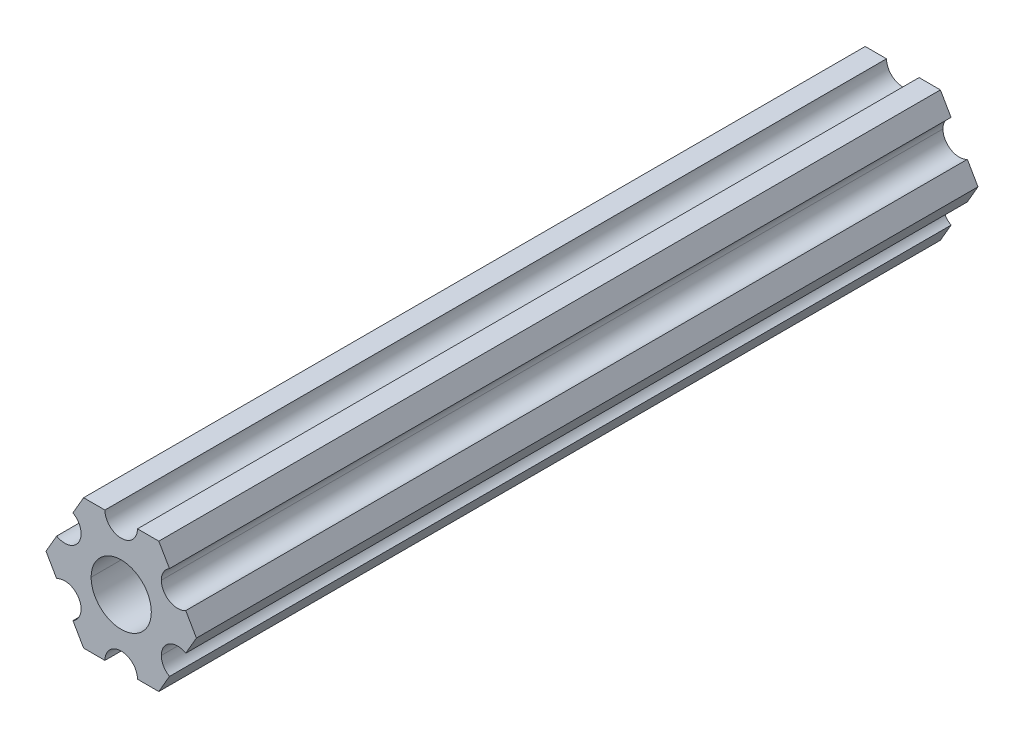
ISO-10303-21;
HEADER;
FILE_DESCRIPTION(('STEP AP214'),'2;1');
FILE_NAME('part.step','',(''),(''),'','','');
FILE_SCHEMA(('AUTOMOTIVE_DESIGN { 1 0 10303 214 1 1 1 1 }'));
ENDSEC;
DATA;
#1=APPLICATION_CONTEXT('core data for automotive mechanical design processes');
#2=APPLICATION_PROTOCOL_DEFINITION('international standard','automotive_design',2000,#1);
#3=PRODUCT_CONTEXT('',#1,'mechanical');
#4=PRODUCT('Part','Part','',(#3));
#5=PRODUCT_RELATED_PRODUCT_CATEGORY('part','',(#4));
#6=PRODUCT_DEFINITION_FORMATION('','',#4);
#7=PRODUCT_DEFINITION_CONTEXT('part definition',#1,'design');
#8=PRODUCT_DEFINITION('design','',#6,#7);
#9=PRODUCT_DEFINITION_SHAPE('','',#8);
#10=(LENGTH_UNIT() NAMED_UNIT(*) SI_UNIT(.MILLI.,.METRE.));
#11=(NAMED_UNIT(*) PLANE_ANGLE_UNIT() SI_UNIT($,.RADIAN.));
#12=(NAMED_UNIT(*) SI_UNIT($,.STERADIAN.) SOLID_ANGLE_UNIT());
#13=UNCERTAINTY_MEASURE_WITH_UNIT(LENGTH_MEASURE(1.E-05),#10,'distance_accuracy_value','');
#14=(GEOMETRIC_REPRESENTATION_CONTEXT(3) GLOBAL_UNCERTAINTY_ASSIGNED_CONTEXT((#13)) GLOBAL_UNIT_ASSIGNED_CONTEXT((#10,
#11,#12)) REPRESENTATION_CONTEXT('',''));
#15=CARTESIAN_POINT('',(0.,0.,0.));
#16=DIRECTION('',(0.,0.,1.));
#17=DIRECTION('',(1.,0.,0.));
#18=AXIS2_PLACEMENT_3D('',#15,#16,#17);
#19=CARTESIAN_POINT('',(6.29301142309098,-1.80018429024546,85.725));
#20=DIRECTION('',(-0.866025434075723,0.499999947533953,0.));
#21=DIRECTION('',(0.,0.,1.));
#22=AXIS2_PLACEMENT_3D('',#19,#20,#21);
#23=PLANE('',#22);
#24=DIRECTION('',(0.499999947533953,0.866025434075723,0.));
#25=VECTOR('',#24,1.);
#26=CARTESIAN_POINT('',(6.29301142309098,-1.80018429024546,76.2));
#27=LINE('',#26,#25);
#28=CARTESIAN_POINT('',(6.29301142309098,-1.80018429024546,76.2));
#29=VERTEX_POINT('',#28);
#30=CARTESIAN_POINT('',(7.33234841870826,4.44212519415746E-07,76.2));
#31=VERTEX_POINT('',#30);
#32=EDGE_CURVE('E398',#29,#31,#27,.T.);
#33=ORIENTED_EDGE('',*,*,#32,.F.);
#34=DIRECTION('',(0.,0.,-1.));
#35=VECTOR('',#34,1.);
#36=CARTESIAN_POINT('',(6.29301142309098,-1.80018429024546,85.725));
#37=LINE('',#36,#35);
#38=CARTESIAN_POINT('',(6.29301142309098,-1.80018429024546,0.));
#39=VERTEX_POINT('',#38);
#40=EDGE_CURVE('E270',#29,#39,#37,.T.);
#41=ORIENTED_EDGE('',*,*,#40,.T.);
#42=DIRECTION('',(0.499999947533953,0.866025434075723,0.));
#43=VECTOR('',#42,1.);
#44=CARTESIAN_POINT('',(6.29301142309098,-1.80018429024546,0.));
#45=LINE('',#44,#43);
#46=CARTESIAN_POINT('',(7.33234841870826,4.44212518961143E-07,0.));
#47=VERTEX_POINT('',#46);
#48=EDGE_CURVE('E292',#39,#47,#45,.T.);
#49=ORIENTED_EDGE('',*,*,#48,.T.);
#50=DIRECTION('',(0.,0.,1.));
#51=VECTOR('',#50,1.);
#52=CARTESIAN_POINT('',(7.33234841870827,4.44212519169686E-07,85.725));
#53=LINE('',#52,#51);
#54=EDGE_CURVE('E65',#47,#31,#53,.T.);
#55=ORIENTED_EDGE('',*,*,#54,.T.);
#56=EDGE_LOOP('',(#33,#41,#49,#55));
#57=FACE_BOUND('',#56,.T.);
#58=ADVANCED_FACE('F57',(#57),#23,.F.);
#59=CARTESIAN_POINT('',(7.33234841870827,4.44212519169686E-07,85.725));
#60=DIRECTION('',(-0.866025373493145,-0.500000052466057,0.));
#61=DIRECTION('',(-0.500000052466057,0.866025373493145,0.));
#62=AXIS2_PLACEMENT_3D('',#59,#60,#61);
#63=PLANE('',#62);
#64=DIRECTION('',(-0.500000052466057,0.866025373493145,0.));
#65=VECTOR('',#64,1.);
#66=CARTESIAN_POINT('',(7.33234841870827,4.44212519169686E-07,76.2));
#67=LINE('',#66,#65);
#68=CARTESIAN_POINT('',(6.29301120497139,1.80018505273895,76.2));
#69=VERTEX_POINT('',#68);
#70=EDGE_CURVE('E406',#31,#69,#67,.T.);
#71=ORIENTED_EDGE('',*,*,#70,.F.);
#72=ORIENTED_EDGE('',*,*,#54,.F.);
#73=DIRECTION('',(-0.500000052466057,0.866025373493145,0.));
#74=VECTOR('',#73,1.);
#75=CARTESIAN_POINT('',(7.33234841870827,4.44212519198906E-07,0.));
#76=LINE('',#75,#74);
#77=CARTESIAN_POINT('',(6.29301120497139,1.80018505273894,0.));
#78=VERTEX_POINT('',#77);
#79=EDGE_CURVE('E288',#47,#78,#76,.T.);
#80=ORIENTED_EDGE('',*,*,#79,.T.);
#81=DIRECTION('',(0.,0.,1.));
#82=VECTOR('',#81,1.);
#83=CARTESIAN_POINT('',(6.29301120497139,1.80018505273894,85.725));
#84=LINE('',#83,#82);
#85=EDGE_CURVE('E390',#78,#69,#84,.T.);
#86=ORIENTED_EDGE('',*,*,#85,.T.);
#87=EDGE_LOOP('',(#71,#72,#80,#86));
#88=FACE_BOUND('',#87,.T.);
#89=ADVANCED_FACE('F404',(#88),#63,.F.);
#90=CARTESIAN_POINT('',(5.49926112168156,3.17500033315934,85.725));
#91=DIRECTION('',(0.,0.,-1.));
#92=DIRECTION('',(-1.,0.,0.));
#93=AXIS2_PLACEMENT_3D('',#90,#91,#92);
#94=CYLINDRICAL_SURFACE('',#93,1.5875);
#95=CARTESIAN_POINT('',(5.49926112168156,3.17500033315934,76.2));
#96=DIRECTION('',(0.,0.,1.));
#97=DIRECTION('',(1.,0.,0.));
#98=AXIS2_PLACEMENT_3D('',#95,#96,#97);
#99=CIRCLE('',#98,1.5875);
#100=CARTESIAN_POINT('',(3.91176112168156,3.17500033315934,76.2));
#101=VERTEX_POINT('',#100);
#102=EDGE_CURVE('E409',#69,#101,#99,.F.);
#103=ORIENTED_EDGE('',*,*,#102,.F.);
#104=ORIENTED_EDGE('',*,*,#85,.F.);
#105=CARTESIAN_POINT('',(5.49926112168156,3.17500033315934,0.));
#106=DIRECTION('',(0.,0.,-1.));
#107=DIRECTION('',(-1.,0.,0.));
#108=AXIS2_PLACEMENT_3D('',#105,#106,#107);
#109=CIRCLE('',#108,1.5875);
#110=CARTESIAN_POINT('',(3.91176112168156,3.17500033315934,0.));
#111=VERTEX_POINT('',#110);
#112=EDGE_CURVE('E262',#78,#111,#109,.T.);
#113=ORIENTED_EDGE('',*,*,#112,.T.);
#114=DIRECTION('',(0.,0.,-1.));
#115=VECTOR('',#114,1.);
#116=CARTESIAN_POINT('',(3.91176112168156,3.17500033315934,85.725));
#117=LINE('',#116,#115);
#118=EDGE_CURVE('E273',#101,#111,#117,.T.);
#119=ORIENTED_EDGE('',*,*,#118,.F.);
#120=EDGE_LOOP('',(#103,#104,#113,#119));
#121=FACE_BOUND('',#120,.T.);
#122=ADVANCED_FACE('F869',(#121),#94,.F.);
#123=CARTESIAN_POINT('',(4.70551103839172,4.54981561357972,85.725));
#124=DIRECTION('',(-0.866025373493151,-0.500000052466046,0.));
#125=DIRECTION('',(-0.500000052466046,0.866025373493151,0.));
#126=AXIS2_PLACEMENT_3D('',#123,#124,#125);
#127=PLANE('',#126);
#128=DIRECTION('',(-0.500000052466046,0.866025373493151,0.));
#129=VECTOR('',#128,1.);
#130=CARTESIAN_POINT('',(4.70551103839172,4.54981561357972,76.2));
#131=LINE('',#130,#129);
#132=CARTESIAN_POINT('',(4.70551103839172,4.54981561357972,76.2));
#133=VERTEX_POINT('',#132);
#134=CARTESIAN_POINT('',(3.66617382465481,6.35000022210627,76.2));
#135=VERTEX_POINT('',#134);
#136=EDGE_CURVE('E479',#133,#135,#131,.T.);
#137=ORIENTED_EDGE('',*,*,#136,.F.);
#138=DIRECTION('',(0.,0.,1.));
#139=VECTOR('',#138,1.);
#140=CARTESIAN_POINT('',(4.70551103839172,4.54981561357972,85.725));
#141=LINE('',#140,#139);
#142=CARTESIAN_POINT('',(4.70551103839172,4.54981561357972,0.));
#143=VERTEX_POINT('',#142);
#144=EDGE_CURVE('E281',#143,#133,#141,.T.);
#145=ORIENTED_EDGE('',*,*,#144,.F.);
#146=DIRECTION('',(-0.500000052466046,0.866025373493151,0.));
#147=VECTOR('',#146,1.);
#148=CARTESIAN_POINT('',(4.70551103839172,4.54981561357972,0.));
#149=LINE('',#148,#147);
#150=CARTESIAN_POINT('',(3.66617382465481,6.35000022210627,0.));
#151=VERTEX_POINT('',#150);
#152=EDGE_CURVE('E259',#143,#151,#149,.T.);
#153=ORIENTED_EDGE('',*,*,#152,.T.);
#154=DIRECTION('',(0.,0.,1.));
#155=VECTOR('',#154,1.);
#156=CARTESIAN_POINT('',(3.66617382465481,6.35000022210627,85.725));
#157=LINE('',#156,#155);
#158=EDGE_CURVE('E386',#151,#135,#157,.T.);
#159=ORIENTED_EDGE('',*,*,#158,.T.);
#160=EDGE_LOOP('',(#137,#145,#153,#159));
#161=FACE_BOUND('',#160,.T.);
#162=ADVANCED_FACE('F491',(#161),#127,.F.);
#163=CARTESIAN_POINT('',(3.66617382465481,6.35000022210627,85.725));
#164=DIRECTION('',(6.05825850611185E-08,-1.,0.));
#165=DIRECTION('',(0.,0.,-1.));
#166=AXIS2_PLACEMENT_3D('',#163,#164,#165);
#167=PLANE('',#166);
#168=DIRECTION('',(-0.999999999999998,-6.05825850611184E-08,0.));
#169=VECTOR('',#168,1.);
#170=CARTESIAN_POINT('',(3.66617382465481,6.35000022210627,76.2));
#171=LINE('',#170,#169);
#172=CARTESIAN_POINT('',(1.58749961530074,6.35,76.2));
#173=VERTEX_POINT('',#172);
#174=EDGE_CURVE('E476',#135,#173,#171,.T.);
#175=ORIENTED_EDGE('',*,*,#174,.F.);
#176=ORIENTED_EDGE('',*,*,#158,.F.);
#177=DIRECTION('',(-1.,0.,0.));
#178=VECTOR('',#177,1.);
#179=CARTESIAN_POINT('',(5.49926112168156,6.35000022210627,0.));
#180=LINE('',#179,#178);
#181=CARTESIAN_POINT('',(1.58749961530073,6.35000015914054,0.));
#182=VERTEX_POINT('',#181);
#183=EDGE_CURVE('E263',#151,#182,#180,.T.);
#184=ORIENTED_EDGE('',*,*,#183,.T.);
#185=DIRECTION('',(0.,0.,1.));
#186=VECTOR('',#185,1.);
#187=CARTESIAN_POINT('',(1.58749961530074,6.35000009617482,85.725));
#188=LINE('',#187,#186);
#189=EDGE_CURVE('E303',#182,#173,#188,.T.);
#190=ORIENTED_EDGE('',*,*,#189,.T.);
#191=EDGE_LOOP('',(#175,#176,#184,#190));
#192=FACE_BOUND('',#191,.T.);
#193=ADVANCED_FACE('F498',(#192),#167,.F.);
#194=CARTESIAN_POINT('',(-3.84699260060323E-07,6.35,85.725));
#195=DIRECTION('',(0.,0.,-1.));
#196=DIRECTION('',(-1.,0.,0.));
#197=AXIS2_PLACEMENT_3D('',#194,#195,#196);
#198=CYLINDRICAL_SURFACE('',#197,1.5875);
#199=CARTESIAN_POINT('',(-3.84699260060323E-07,6.35,76.2));
#200=DIRECTION('',(0.,0.,1.));
#201=DIRECTION('',(1.,0.,0.));
#202=AXIS2_PLACEMENT_3D('',#199,#200,#201);
#203=CIRCLE('',#202,1.5875);
#204=CARTESIAN_POINT('',(-1.58750038469926,6.34999990382518,76.2));
#205=VERTEX_POINT('',#204);
#206=EDGE_CURVE('E473',#173,#205,#203,.F.);
#207=ORIENTED_EDGE('',*,*,#206,.F.);
#208=ORIENTED_EDGE('',*,*,#189,.F.);
#209=CARTESIAN_POINT('',(-3.84699260060323E-07,6.35,0.));
#210=DIRECTION('',(0.,0.,-1.));
#211=DIRECTION('',(-1.,0.,0.));
#212=AXIS2_PLACEMENT_3D('',#209,#210,#211);
#213=CIRCLE('',#212,1.5875);
#214=CARTESIAN_POINT('',(-1.58750038469926,6.34999990382519,0.));
#215=VERTEX_POINT('',#214);
#216=EDGE_CURVE('E329',#182,#215,#213,.T.);
#217=ORIENTED_EDGE('',*,*,#216,.T.);
#218=DIRECTION('',(0.,0.,1.));
#219=VECTOR('',#218,1.);
#220=CARTESIAN_POINT('',(-1.58750038469926,6.34999990382518,85.725));
#221=LINE('',#220,#219);
#222=EDGE_CURVE('E299',#215,#205,#221,.T.);
#223=ORIENTED_EDGE('',*,*,#222,.T.);
#224=EDGE_LOOP('',(#207,#208,#217,#223));
#225=FACE_BOUND('',#224,.T.);
#226=ADVANCED_FACE('F502',(#225),#198,.F.);
#227=CARTESIAN_POINT('',(-1.58750038469926,6.34999990382518,85.725));
#228=DIRECTION('',(6.05825963273174E-08,-1.,0.));
#229=DIRECTION('',(0.,0.,-1.));
#230=AXIS2_PLACEMENT_3D('',#227,#228,#229);
#231=PLANE('',#230);
#232=DIRECTION('',(-0.999999999999998,-6.05825963273173E-08,0.));
#233=VECTOR('',#232,1.);
#234=CARTESIAN_POINT('',(-1.58750038469926,6.34999990382518,76.2));
#235=LINE('',#234,#233);
#236=CARTESIAN_POINT('',(-3.66617454558244,6.34999986184803,76.2));
#237=VERTEX_POINT('',#236);
#238=EDGE_CURVE('E470',#205,#237,#235,.T.);
#239=ORIENTED_EDGE('',*,*,#238,.F.);
#240=ORIENTED_EDGE('',*,*,#222,.F.);
#241=DIRECTION('',(-1.,0.,0.));
#242=VECTOR('',#241,1.);
#243=CARTESIAN_POINT('',(5.49926112168156,6.34999990382519,0.));
#244=LINE('',#243,#242);
#245=CARTESIAN_POINT('',(-3.66617454558244,6.34999986184803,0.));
#246=VERTEX_POINT('',#245);
#247=EDGE_CURVE('E333',#215,#246,#244,.T.);
#248=ORIENTED_EDGE('',*,*,#247,.T.);
#249=DIRECTION('',(0.,0.,1.));
#250=VECTOR('',#249,1.);
#251=CARTESIAN_POINT('',(-3.66617459405349,6.3499997778937,85.725));
#252=LINE('',#251,#250);
#253=EDGE_CURVE('E286',#246,#237,#252,.T.);
#254=ORIENTED_EDGE('',*,*,#253,.T.);
#255=EDGE_LOOP('',(#239,#240,#248,#254));
#256=FACE_BOUND('',#255,.T.);
#257=ADVANCED_FACE('F504',(#256),#231,.F.);
#258=CARTESIAN_POINT('',(-3.66617459405349,6.3499997778937,85.725));
#259=DIRECTION('',(0.866025434075729,-0.499999947533942,0.));
#260=DIRECTION('',(0.,0.,-1.));
#261=AXIS2_PLACEMENT_3D('',#258,#259,#260);
#262=PLANE('',#261);
#263=DIRECTION('',(-0.499999947533942,-0.866025434075729,0.));
#264=VECTOR('',#263,1.);
#265=CARTESIAN_POINT('',(-3.66617459405349,6.3499997778937,76.2));
#266=LINE('',#265,#264);
#267=CARTESIAN_POINT('',(-4.70551158967065,4.54981504343587,76.2));
#268=VERTEX_POINT('',#267);
#269=EDGE_CURVE('E467',#237,#268,#266,.T.);
#270=ORIENTED_EDGE('',*,*,#269,.F.);
#271=ORIENTED_EDGE('',*,*,#253,.F.);
#272=DIRECTION('',(-0.499999947533943,-0.866025434075729,0.));
#273=VECTOR('',#272,1.);
#274=CARTESIAN_POINT('',(-3.66617459405349,6.3499997778937,0.));
#275=LINE('',#274,#273);
#276=CARTESIAN_POINT('',(-4.70551158967065,4.54981504343587,0.));
#277=VERTEX_POINT('',#276);
#278=EDGE_CURVE('E345',#246,#277,#275,.T.);
#279=ORIENTED_EDGE('',*,*,#278,.T.);
#280=DIRECTION('',(0.,0.,1.));
#281=VECTOR('',#280,1.);
#282=CARTESIAN_POINT('',(-4.70551158967065,4.54981504343587,85.725));
#283=LINE('',#282,#281);
#284=EDGE_CURVE('E282',#277,#268,#283,.T.);
#285=ORIENTED_EDGE('',*,*,#284,.T.);
#286=EDGE_LOOP('',(#270,#271,#279,#285));
#287=FACE_BOUND('',#286,.T.);
#288=ADVANCED_FACE('F509',(#287),#262,.F.);
#289=CARTESIAN_POINT('',(-5.49926150638082,3.17499966684067,85.725));
#290=DIRECTION('',(0.,0.,-1.));
#291=DIRECTION('',(-1.,0.,0.));
#292=AXIS2_PLACEMENT_3D('',#289,#290,#291);
#293=CYLINDRICAL_SURFACE('',#292,1.5875);
#294=CARTESIAN_POINT('',(-5.49926150638082,3.17499966684067,76.2));
#295=DIRECTION('',(0.,0.,1.));
#296=DIRECTION('',(1.,0.,0.));
#297=AXIS2_PLACEMENT_3D('',#294,#295,#296);
#298=CIRCLE('',#297,1.5875);
#299=CARTESIAN_POINT('',(-6.29301142309098,1.80018429024547,76.2));
#300=VERTEX_POINT('',#299);
#301=EDGE_CURVE('E464',#268,#300,#298,.F.);
#302=ORIENTED_EDGE('',*,*,#301,.F.);
#303=ORIENTED_EDGE('',*,*,#284,.F.);
#304=CARTESIAN_POINT('',(-5.49926150638082,3.17499966684067,0.));
#305=DIRECTION('',(0.,0.,-1.));
#306=DIRECTION('',(-1.,0.,0.));
#307=AXIS2_PLACEMENT_3D('',#304,#305,#306);
#308=CIRCLE('',#307,1.5875);
#309=CARTESIAN_POINT('',(-6.29301142309098,1.80018429024547,0.));
#310=VERTEX_POINT('',#309);
#311=EDGE_CURVE('E341',#277,#310,#308,.T.);
#312=ORIENTED_EDGE('',*,*,#311,.T.);
#313=DIRECTION('',(0.,0.,1.));
#314=VECTOR('',#313,1.);
#315=CARTESIAN_POINT('',(-6.29301142309098,1.80018429024547,85.725));
#316=LINE('',#315,#314);
#317=EDGE_CURVE('E287',#310,#300,#316,.T.);
#318=ORIENTED_EDGE('',*,*,#317,.T.);
#319=EDGE_LOOP('',(#302,#303,#312,#318));
#320=FACE_BOUND('',#319,.T.);
#321=ADVANCED_FACE('F512',(#320),#293,.F.);
#322=CARTESIAN_POINT('',(-6.29301142309098,1.80018429024547,85.725));
#323=DIRECTION('',(0.866025434075724,-0.499999947533952,0.));
#324=DIRECTION('',(0.,0.,-1.));
#325=AXIS2_PLACEMENT_3D('',#322,#323,#324);
#326=PLANE('',#325);
#327=DIRECTION('',(-0.499999947533952,-0.866025434075724,0.));
#328=VECTOR('',#327,1.);
#329=CARTESIAN_POINT('',(-6.29301142309098,1.80018429024547,76.2));
#330=LINE('',#329,#328);
#331=CARTESIAN_POINT('',(-7.33234841870827,-4.44212524036369E-07,76.2));
#332=VERTEX_POINT('',#331);
#333=EDGE_CURVE('E461',#300,#332,#330,.T.);
#334=ORIENTED_EDGE('',*,*,#333,.F.);
#335=ORIENTED_EDGE('',*,*,#317,.F.);
#336=DIRECTION('',(-0.499999947533952,-0.866025434075724,0.));
#337=VECTOR('',#336,1.);
#338=CARTESIAN_POINT('',(-6.29301142309098,1.80018429024547,0.));
#339=LINE('',#338,#337);
#340=CARTESIAN_POINT('',(-7.33234841870826,-4.44212524036367E-07,0.));
#341=VERTEX_POINT('',#340);
#342=EDGE_CURVE('E337',#310,#341,#339,.T.);
#343=ORIENTED_EDGE('',*,*,#342,.T.);
#344=DIRECTION('',(0.,0.,1.));
#345=VECTOR('',#344,1.);
#346=CARTESIAN_POINT('',(-7.33234841870827,-4.44212523790841E-07,85.725));
#347=LINE('',#346,#345);
#348=EDGE_CURVE('E269',#341,#332,#347,.T.);
#349=ORIENTED_EDGE('',*,*,#348,.T.);
#350=EDGE_LOOP('',(#334,#335,#343,#349));
#351=FACE_BOUND('',#350,.T.);
#352=ADVANCED_FACE('F517',(#351),#326,.F.);
#353=CARTESIAN_POINT('',(-7.33234841870827,-4.44212523790841E-07,85.725));
#354=DIRECTION('',(0.866025373493151,0.500000052466045,0.));
#355=DIRECTION('',(0.,0.,-1.));
#356=AXIS2_PLACEMENT_3D('',#353,#354,#355);
#357=PLANE('',#356);
#358=DIRECTION('',(0.500000052466045,-0.866025373493151,0.));
#359=VECTOR('',#358,1.);
#360=CARTESIAN_POINT('',(-7.33234841870827,-4.44212523790841E-07,76.2));
#361=LINE('',#360,#359);
#362=CARTESIAN_POINT('',(-6.29301120497141,-1.80018505273896,76.2));
#363=VERTEX_POINT('',#362);
#364=EDGE_CURVE('E458',#332,#363,#361,.T.);
#365=ORIENTED_EDGE('',*,*,#364,.F.);
#366=ORIENTED_EDGE('',*,*,#348,.F.);
#367=DIRECTION('',(0.500000052466045,-0.866025373493151,0.));
#368=VECTOR('',#367,1.);
#369=CARTESIAN_POINT('',(-7.33234841870827,-4.44212523969395E-07,0.));
#370=LINE('',#369,#368);
#371=CARTESIAN_POINT('',(-6.29301120497141,-1.80018505273897,0.));
#372=VERTEX_POINT('',#371);
#373=EDGE_CURVE('E308',#341,#372,#370,.T.);
#374=ORIENTED_EDGE('',*,*,#373,.T.);
#375=DIRECTION('',(0.,0.,1.));
#376=VECTOR('',#375,1.);
#377=CARTESIAN_POINT('',(-6.29301120497141,-1.80018505273897,85.725));
#378=LINE('',#377,#376);
#379=EDGE_CURVE('E265',#372,#363,#378,.T.);
#380=ORIENTED_EDGE('',*,*,#379,.T.);
#381=EDGE_LOOP('',(#365,#366,#374,#380));
#382=FACE_BOUND('',#381,.T.);
#383=ADVANCED_FACE('F520',(#382),#357,.F.);
#384=CARTESIAN_POINT('',(-5.49926112168156,-3.17500033315934,85.725));
#385=DIRECTION('',(0.,0.,-1.));
#386=DIRECTION('',(-1.,0.,0.));
#387=AXIS2_PLACEMENT_3D('',#384,#385,#386);
#388=CYLINDRICAL_SURFACE('',#387,1.5875);
#389=CARTESIAN_POINT('',(-5.49926112168156,-3.17500033315934,76.2));
#390=DIRECTION('',(0.,0.,1.));
#391=DIRECTION('',(1.,0.,0.));
#392=AXIS2_PLACEMENT_3D('',#389,#390,#391);
#393=CIRCLE('',#392,1.5875);
#394=CARTESIAN_POINT('',(-4.70551103839172,-4.54981561357972,76.2));
#395=VERTEX_POINT('',#394);
#396=EDGE_CURVE('E455',#363,#395,#393,.F.);
#397=ORIENTED_EDGE('',*,*,#396,.F.);
#398=ORIENTED_EDGE('',*,*,#379,.F.);
#399=CARTESIAN_POINT('',(-5.49926112168156,-3.17500033315934,0.));
#400=DIRECTION('',(0.,0.,-1.));
#401=DIRECTION('',(-1.,0.,0.));
#402=AXIS2_PLACEMENT_3D('',#399,#400,#401);
#403=CIRCLE('',#402,1.5875);
#404=CARTESIAN_POINT('',(-4.70551103839172,-4.54981561357972,0.));
#405=VERTEX_POINT('',#404);
#406=EDGE_CURVE('E304',#372,#405,#403,.T.);
#407=ORIENTED_EDGE('',*,*,#406,.T.);
#408=DIRECTION('',(0.,0.,1.));
#409=VECTOR('',#408,1.);
#410=CARTESIAN_POINT('',(-4.70551103839172,-4.54981561357972,85.725));
#411=LINE('',#410,#409);
#412=EDGE_CURVE('E252',#405,#395,#411,.T.);
#413=ORIENTED_EDGE('',*,*,#412,.T.);
#414=EDGE_LOOP('',(#397,#398,#407,#413));
#415=FACE_BOUND('',#414,.T.);
#416=ADVANCED_FACE('F526',(#415),#388,.F.);
#417=CARTESIAN_POINT('',(-4.70551103839172,-4.54981561357972,85.725));
#418=DIRECTION('',(0.866025373493152,0.500000052466045,0.));
#419=DIRECTION('',(0.,0.,-1.));
#420=AXIS2_PLACEMENT_3D('',#417,#418,#419);
#421=PLANE('',#420);
#422=DIRECTION('',(0.500000052466045,-0.866025373493152,0.));
#423=VECTOR('',#422,1.);
#424=CARTESIAN_POINT('',(-4.70551103839172,-4.54981561357972,76.2));
#425=LINE('',#424,#423);
#426=CARTESIAN_POINT('',(-3.66617382465481,-6.35000022210628,76.2));
#427=VERTEX_POINT('',#426);
#428=EDGE_CURVE('E452',#395,#427,#425,.T.);
#429=ORIENTED_EDGE('',*,*,#428,.F.);
#430=ORIENTED_EDGE('',*,*,#412,.F.);
#431=DIRECTION('',(0.500000052466045,-0.866025373493151,0.));
#432=VECTOR('',#431,1.);
#433=CARTESIAN_POINT('',(-4.70551103839172,-4.54981561357972,0.));
#434=LINE('',#433,#432);
#435=CARTESIAN_POINT('',(-3.66617382465481,-6.35000022210628,0.));
#436=VERTEX_POINT('',#435);
#437=EDGE_CURVE('E309',#405,#436,#434,.T.);
#438=ORIENTED_EDGE('',*,*,#437,.T.);
#439=DIRECTION('',(0.,0.,1.));
#440=VECTOR('',#439,1.);
#441=CARTESIAN_POINT('',(-3.66617382465481,-6.35000022210628,85.725));
#442=LINE('',#441,#440);
#443=EDGE_CURVE('E370',#436,#427,#442,.T.);
#444=ORIENTED_EDGE('',*,*,#443,.T.);
#445=EDGE_LOOP('',(#429,#430,#438,#444));
#446=FACE_BOUND('',#445,.T.);
#447=ADVANCED_FACE('F807',(#446),#421,.F.);
#448=CARTESIAN_POINT('',(-3.66617382465481,-6.35000022210628,85.725));
#449=DIRECTION('',(-6.05825854783851E-08,1.,0.));
#450=DIRECTION('',(0.,0.,1.));
#451=AXIS2_PLACEMENT_3D('',#448,#449,#450);
#452=PLANE('',#451);
#453=DIRECTION('',(0.999999999999998,6.0582585478385E-08,0.));
#454=VECTOR('',#453,1.);
#455=CARTESIAN_POINT('',(-3.66617382465481,-6.35000022210628,76.2));
#456=LINE('',#455,#454);
#457=CARTESIAN_POINT('',(-1.58749961530073,-6.35000011105314,76.2));
#458=VERTEX_POINT('',#457);
#459=EDGE_CURVE('E449',#427,#458,#456,.T.);
#460=ORIENTED_EDGE('',*,*,#459,.F.);
#461=ORIENTED_EDGE('',*,*,#443,.F.);
#462=DIRECTION('',(1.,0.,0.));
#463=VECTOR('',#462,1.);
#464=CARTESIAN_POINT('',(5.49926112168156,-6.35000022210628,0.));
#465=LINE('',#464,#463);
#466=CARTESIAN_POINT('',(-1.58749961530073,-6.35000011105314,0.));
#467=VERTEX_POINT('',#466);
#468=EDGE_CURVE('E322',#436,#467,#465,.T.);
#469=ORIENTED_EDGE('',*,*,#468,.T.);
#470=DIRECTION('',(0.,0.,1.));
#471=VECTOR('',#470,1.);
#472=CARTESIAN_POINT('',(-1.58749961530074,-6.35,85.725));
#473=LINE('',#472,#471);
#474=EDGE_CURVE('E369',#467,#458,#473,.T.);
#475=ORIENTED_EDGE('',*,*,#474,.T.);
#476=EDGE_LOOP('',(#460,#461,#469,#475));
#477=FACE_BOUND('',#476,.T.);
#478=ADVANCED_FACE('F799',(#477),#452,.F.);
#479=CARTESIAN_POINT('',(3.8469926204343E-07,-6.35,85.725));
#480=DIRECTION('',(0.,0.,-1.));
#481=DIRECTION('',(-1.,0.,0.));
#482=AXIS2_PLACEMENT_3D('',#479,#480,#481);
#483=CYLINDRICAL_SURFACE('',#482,1.5875);
#484=CARTESIAN_POINT('',(3.8469926204343E-07,-6.35,76.2));
#485=DIRECTION('',(0.,0.,1.));
#486=DIRECTION('',(1.,0.,0.));
#487=AXIS2_PLACEMENT_3D('',#484,#485,#486);
#488=CIRCLE('',#487,1.5875);
#489=CARTESIAN_POINT('',(1.58750038469926,-6.34999990382518,76.2));
#490=VERTEX_POINT('',#489);
#491=EDGE_CURVE('E446',#458,#490,#488,.F.);
#492=ORIENTED_EDGE('',*,*,#491,.F.);
#493=ORIENTED_EDGE('',*,*,#474,.F.);
#494=CARTESIAN_POINT('',(3.8469926204343E-07,-6.35,0.));
#495=DIRECTION('',(0.,0.,-1.));
#496=DIRECTION('',(-1.,0.,0.));
#497=AXIS2_PLACEMENT_3D('',#494,#495,#496);
#498=CIRCLE('',#497,1.5875);
#499=CARTESIAN_POINT('',(1.58750038469926,-6.34999990382519,0.));
#500=VERTEX_POINT('',#499);
#501=EDGE_CURVE('E257',#467,#500,#498,.T.);
#502=ORIENTED_EDGE('',*,*,#501,.T.);
#503=DIRECTION('',(0.,0.,1.));
#504=VECTOR('',#503,1.);
#505=CARTESIAN_POINT('',(1.58750038469926,-6.34999990382518,85.725));
#506=LINE('',#505,#504);
#507=EDGE_CURVE('E314',#500,#490,#506,.T.);
#508=ORIENTED_EDGE('',*,*,#507,.T.);
#509=EDGE_LOOP('',(#492,#493,#502,#508));
#510=FACE_BOUND('',#509,.T.);
#511=ADVANCED_FACE('F791',(#510),#483,.F.);
#512=CARTESIAN_POINT('',(1.58750038469926,-6.34999990382518,85.725));
#513=DIRECTION('',(-6.05825721258438E-08,1.,0.));
#514=DIRECTION('',(0.,0.,1.));
#515=AXIS2_PLACEMENT_3D('',#512,#513,#514);
#516=PLANE('',#515);
#517=DIRECTION('',(0.999999999999998,6.05825721258437E-08,0.));
#518=VECTOR('',#517,1.);
#519=CARTESIAN_POINT('',(1.58750038469926,-6.34999990382518,76.2));
#520=LINE('',#519,#518);
#521=CARTESIAN_POINT('',(3.66617454558243,-6.34999986184804,76.2));
#522=VERTEX_POINT('',#521);
#523=EDGE_CURVE('E443',#490,#522,#520,.T.);
#524=ORIENTED_EDGE('',*,*,#523,.F.);
#525=ORIENTED_EDGE('',*,*,#507,.F.);
#526=DIRECTION('',(1.,0.,0.));
#527=VECTOR('',#526,1.);
#528=CARTESIAN_POINT('',(5.49926112168156,-6.34999990382519,0.));
#529=LINE('',#528,#527);
#530=CARTESIAN_POINT('',(3.66617454558244,-6.34999986184804,0.));
#531=VERTEX_POINT('',#530);
#532=EDGE_CURVE('E253',#500,#531,#529,.T.);
#533=ORIENTED_EDGE('',*,*,#532,.T.);
#534=DIRECTION('',(0.,0.,1.));
#535=VECTOR('',#534,1.);
#536=CARTESIAN_POINT('',(3.66617459405346,-6.34999977789375,85.725));
#537=LINE('',#536,#535);
#538=EDGE_CURVE('E310',#531,#522,#537,.T.);
#539=ORIENTED_EDGE('',*,*,#538,.T.);
#540=EDGE_LOOP('',(#524,#525,#533,#539));
#541=FACE_BOUND('',#540,.T.);
#542=ADVANCED_FACE('F783',(#541),#516,.F.);
#543=CARTESIAN_POINT('',(3.66617459405346,-6.34999977789375,85.725));
#544=DIRECTION('',(-0.86602543407573,0.499999947533941,0.));
#545=DIRECTION('',(0.,0.,1.));
#546=AXIS2_PLACEMENT_3D('',#543,#544,#545);
#547=PLANE('',#546);
#548=DIRECTION('',(0.499999947533941,0.86602543407573,0.));
#549=VECTOR('',#548,1.);
#550=CARTESIAN_POINT('',(3.66617459405346,-6.34999977789375,76.2));
#551=LINE('',#550,#549);
#552=CARTESIAN_POINT('',(4.70551158967065,-4.54981504343587,76.2));
#553=VERTEX_POINT('',#552);
#554=EDGE_CURVE('E438',#522,#553,#551,.T.);
#555=ORIENTED_EDGE('',*,*,#554,.F.);
#556=ORIENTED_EDGE('',*,*,#538,.F.);
#557=DIRECTION('',(0.49999994753394,0.86602543407573,0.));
#558=VECTOR('',#557,1.);
#559=CARTESIAN_POINT('',(3.66617459405346,-6.34999977789376,0.));
#560=LINE('',#559,#558);
#561=CARTESIAN_POINT('',(4.70551158967065,-4.54981504343587,0.));
#562=VERTEX_POINT('',#561);
#563=EDGE_CURVE('E258',#531,#562,#560,.T.);
#564=ORIENTED_EDGE('',*,*,#563,.T.);
#565=DIRECTION('',(0.,0.,-1.));
#566=VECTOR('',#565,1.);
#567=CARTESIAN_POINT('',(4.70551158967065,-4.54981504343587,85.725));
#568=LINE('',#567,#566);
#569=EDGE_CURVE('E315',#553,#562,#568,.T.);
#570=ORIENTED_EDGE('',*,*,#569,.F.);
#571=EDGE_LOOP('',(#555,#556,#564,#570));
#572=FACE_BOUND('',#571,.T.);
#573=ADVANCED_FACE('F777',(#572),#547,.F.);
#574=CARTESIAN_POINT('',(5.49926150638082,-3.17499966684067,85.725));
#575=DIRECTION('',(0.,0.,-1.));
#576=DIRECTION('',(-1.,0.,0.));
#577=AXIS2_PLACEMENT_3D('',#574,#575,#576);
#578=CYLINDRICAL_SURFACE('',#577,1.5875);
#579=CARTESIAN_POINT('',(5.49926150638082,-3.17499966684067,76.2));
#580=DIRECTION('',(0.,0.,1.));
#581=DIRECTION('',(1.,0.,0.));
#582=AXIS2_PLACEMENT_3D('',#579,#580,#581);
#583=CIRCLE('',#582,1.5875);
#584=CARTESIAN_POINT('',(3.91176150638082,-3.17499966684067,76.2));
#585=VERTEX_POINT('',#584);
#586=EDGE_CURVE('E72',#553,#585,#583,.F.);
#587=ORIENTED_EDGE('',*,*,#586,.F.);
#588=ORIENTED_EDGE('',*,*,#569,.T.);
#589=CARTESIAN_POINT('',(5.49926150638082,-3.17499966684067,0.));
#590=DIRECTION('',(0.,0.,-1.));
#591=DIRECTION('',(-1.,0.,0.));
#592=AXIS2_PLACEMENT_3D('',#589,#590,#591);
#593=CIRCLE('',#592,1.5875);
#594=CARTESIAN_POINT('',(3.91176150638082,-3.17499966684067,0.));
#595=VERTEX_POINT('',#594);
#596=EDGE_CURVE('E280',#562,#595,#593,.T.);
#597=ORIENTED_EDGE('',*,*,#596,.T.);
#598=DIRECTION('',(0.,0.,-1.));
#599=VECTOR('',#598,1.);
#600=CARTESIAN_POINT('',(3.91176150638082,-3.17499966684067,85.725));
#601=LINE('',#600,#599);
#602=EDGE_CURVE('E242',#585,#595,#601,.T.);
#603=ORIENTED_EDGE('',*,*,#602,.F.);
#604=EDGE_LOOP('',(#587,#588,#597,#603));
#605=FACE_BOUND('',#604,.T.);
#606=ADVANCED_FACE('F428',(#605),#578,.F.);
#607=CARTESIAN_POINT('',(0.,0.,85.725));
#608=DIRECTION('',(0.,0.,-1.));
#609=DIRECTION('',(-1.,0.,0.));
#610=AXIS2_PLACEMENT_3D('',#607,#608,#609);
#611=CYLINDRICAL_SURFACE('',#610,2.9337);
#612=CARTESIAN_POINT('',(0.,0.,76.2));
#613=DIRECTION('',(0.,0.,1.));
#614=DIRECTION('',(1.,0.,0.));
#615=AXIS2_PLACEMENT_3D('',#612,#613,#614);
#616=CIRCLE('',#615,2.9337);
#617=CARTESIAN_POINT('',(-2.9337,0.,76.2));
#618=VERTEX_POINT('',#617);
#619=CARTESIAN_POINT('',(2.9337,0.,76.2));
#620=VERTEX_POINT('',#619);
#621=EDGE_CURVE('E78',#618,#620,#616,.F.);
#622=ORIENTED_EDGE('',*,*,#621,.F.);
#623=DIRECTION('',(0.,0.,-1.));
#624=VECTOR('',#623,1.);
#625=CARTESIAN_POINT('',(-2.9337,0.,85.725));
#626=LINE('',#625,#624);
#627=CARTESIAN_POINT('',(-2.9337,0.,0.));
#628=VERTEX_POINT('',#627);
#629=EDGE_CURVE('E231',#618,#628,#626,.T.);
#630=ORIENTED_EDGE('',*,*,#629,.T.);
#631=CARTESIAN_POINT('',(0.,0.,0.));
#632=DIRECTION('',(0.,0.,1.));
#633=DIRECTION('',(-1.,0.,0.));
#634=AXIS2_PLACEMENT_3D('',#631,#632,#633);
#635=CIRCLE('',#634,2.9337);
#636=CARTESIAN_POINT('',(2.9337,0.,0.));
#637=VERTEX_POINT('',#636);
#638=EDGE_CURVE('E277',#637,#628,#635,.T.);
#639=ORIENTED_EDGE('',*,*,#638,.F.);
#640=DIRECTION('',(0.,0.,-1.));
#641=VECTOR('',#640,1.);
#642=CARTESIAN_POINT('',(2.9337,0.,85.725));
#643=LINE('',#642,#641);
#644=EDGE_CURVE('E233',#620,#637,#643,.T.);
#645=ORIENTED_EDGE('',*,*,#644,.F.);
#646=EDGE_LOOP('',(#622,#630,#639,#645));
#647=FACE_BOUND('',#646,.T.);
#648=ADVANCED_FACE('F229',(#647),#611,.F.);
#649=CARTESIAN_POINT('',(5.49926112168156,3.17500033315934,85.725));
#650=DIRECTION('',(0.,0.,-1.));
#651=DIRECTION('',(-1.,0.,0.));
#652=AXIS2_PLACEMENT_3D('',#649,#650,#651);
#653=CYLINDRICAL_SURFACE('',#652,1.5875);
#654=CARTESIAN_POINT('',(5.49926112168156,3.17500033315934,76.2));
#655=DIRECTION('',(0.,0.,1.));
#656=DIRECTION('',(1.,0.,0.));
#657=AXIS2_PLACEMENT_3D('',#654,#655,#656);
#658=CIRCLE('',#657,1.5875);
#659=EDGE_CURVE('E414',#101,#133,#658,.F.);
#660=ORIENTED_EDGE('',*,*,#659,.F.);
#661=ORIENTED_EDGE('',*,*,#118,.T.);
#662=CARTESIAN_POINT('',(5.49926112168156,3.17500033315934,0.));
#663=DIRECTION('',(0.,0.,-1.));
#664=DIRECTION('',(-1.,0.,0.));
#665=AXIS2_PLACEMENT_3D('',#662,#663,#664);
#666=CIRCLE('',#665,1.5875);
#667=EDGE_CURVE('E276',#111,#143,#666,.T.);
#668=ORIENTED_EDGE('',*,*,#667,.T.);
#669=ORIENTED_EDGE('',*,*,#144,.T.);
#670=EDGE_LOOP('',(#660,#661,#668,#669));
#671=FACE_BOUND('',#670,.T.);
#672=ADVANCED_FACE('F492',(#671),#653,.F.);
#673=CARTESIAN_POINT('',(5.49926150638082,-3.17499966684067,85.725));
#674=DIRECTION('',(0.,0.,-1.));
#675=DIRECTION('',(-1.,0.,0.));
#676=AXIS2_PLACEMENT_3D('',#673,#674,#675);
#677=CYLINDRICAL_SURFACE('',#676,1.5875);
#678=CARTESIAN_POINT('',(5.49926150638082,-3.17499966684067,76.2));
#679=DIRECTION('',(0.,0.,1.));
#680=DIRECTION('',(1.,0.,0.));
#681=AXIS2_PLACEMENT_3D('',#678,#679,#680);
#682=CIRCLE('',#681,1.5875);
#683=EDGE_CURVE('E235',#585,#29,#682,.F.);
#684=ORIENTED_EDGE('',*,*,#683,.F.);
#685=ORIENTED_EDGE('',*,*,#602,.T.);
#686=CARTESIAN_POINT('',(5.49926150638082,-3.17499966684067,0.));
#687=DIRECTION('',(0.,0.,-1.));
#688=DIRECTION('',(-1.,0.,0.));
#689=AXIS2_PLACEMENT_3D('',#686,#687,#688);
#690=CIRCLE('',#689,1.5875);
#691=EDGE_CURVE('E247',#595,#39,#690,.T.);
#692=ORIENTED_EDGE('',*,*,#691,.T.);
#693=ORIENTED_EDGE('',*,*,#40,.F.);
#694=EDGE_LOOP('',(#684,#685,#692,#693));
#695=FACE_BOUND('',#694,.T.);
#696=ADVANCED_FACE('F434',(#695),#677,.F.);
#697=CARTESIAN_POINT('',(0.,0.,85.725));
#698=DIRECTION('',(0.,0.,-1.));
#699=DIRECTION('',(-1.,0.,0.));
#700=AXIS2_PLACEMENT_3D('',#697,#698,#699);
#701=CYLINDRICAL_SURFACE('',#700,2.9337);
#702=CARTESIAN_POINT('',(0.,0.,76.2));
#703=DIRECTION('',(0.,0.,1.));
#704=DIRECTION('',(1.,0.,0.));
#705=AXIS2_PLACEMENT_3D('',#702,#703,#704);
#706=CIRCLE('',#705,2.9337);
#707=EDGE_CURVE('E12',#620,#618,#706,.F.);
#708=ORIENTED_EDGE('',*,*,#707,.F.);
#709=ORIENTED_EDGE('',*,*,#644,.T.);
#710=CARTESIAN_POINT('',(0.,0.,0.));
#711=DIRECTION('',(0.,0.,1.));
#712=DIRECTION('',(-1.,0.,0.));
#713=AXIS2_PLACEMENT_3D('',#710,#711,#712);
#714=CIRCLE('',#713,2.9337);
#715=EDGE_CURVE('E240',#628,#637,#714,.T.);
#716=ORIENTED_EDGE('',*,*,#715,.F.);
#717=ORIENTED_EDGE('',*,*,#629,.F.);
#718=EDGE_LOOP('',(#708,#709,#716,#717));
#719=FACE_BOUND('',#718,.T.);
#720=ADVANCED_FACE('F238',(#719),#701,.F.);
#721=CARTESIAN_POINT('',(5.49926112168156,3.17500033315934,0.));
#722=DIRECTION('',(0.,0.,1.));
#723=DIRECTION('',(1.,0.,0.));
#724=AXIS2_PLACEMENT_3D('',#721,#722,#723);
#725=PLANE('',#724);
#726=ORIENTED_EDGE('',*,*,#715,.T.);
#727=ORIENTED_EDGE('',*,*,#638,.T.);
#728=EDGE_LOOP('',(#726,#727));
#729=FACE_BOUND('',#728,.T.);
#730=ORIENTED_EDGE('',*,*,#596,.F.);
#731=ORIENTED_EDGE('',*,*,#563,.F.);
#732=ORIENTED_EDGE('',*,*,#532,.F.);
#733=ORIENTED_EDGE('',*,*,#501,.F.);
#734=ORIENTED_EDGE('',*,*,#468,.F.);
#735=ORIENTED_EDGE('',*,*,#437,.F.);
#736=ORIENTED_EDGE('',*,*,#406,.F.);
#737=ORIENTED_EDGE('',*,*,#373,.F.);
#738=ORIENTED_EDGE('',*,*,#342,.F.);
#739=ORIENTED_EDGE('',*,*,#311,.F.);
#740=ORIENTED_EDGE('',*,*,#278,.F.);
#741=ORIENTED_EDGE('',*,*,#247,.F.);
#742=ORIENTED_EDGE('',*,*,#216,.F.);
#743=ORIENTED_EDGE('',*,*,#183,.F.);
#744=ORIENTED_EDGE('',*,*,#152,.F.);
#745=ORIENTED_EDGE('',*,*,#667,.F.);
#746=ORIENTED_EDGE('',*,*,#112,.F.);
#747=ORIENTED_EDGE('',*,*,#79,.F.);
#748=ORIENTED_EDGE('',*,*,#48,.F.);
#749=ORIENTED_EDGE('',*,*,#691,.F.);
#750=EDGE_LOOP('',(#730,#731,#732,#733,#734,#735,#736,#737,#738,#739,#740,#741,#742,#743,#744,
#745,#746,#747,#748,#749));
#751=FACE_BOUND('',#750,.T.);
#752=ADVANCED_FACE('F432',(#729,#751),#725,.F.);
#753=CARTESIAN_POINT('',(5.49926112168156,3.17500033315934,76.2));
#754=DIRECTION('',(0.,0.,1.));
#755=DIRECTION('',(1.,0.,0.));
#756=AXIS2_PLACEMENT_3D('',#753,#754,#755);
#757=PLANE('',#756);
#758=ORIENTED_EDGE('',*,*,#621,.T.);
#759=ORIENTED_EDGE('',*,*,#707,.T.);
#760=EDGE_LOOP('',(#758,#759));
#761=FACE_BOUND('',#760,.T.);
#762=ORIENTED_EDGE('',*,*,#70,.T.);
#763=ORIENTED_EDGE('',*,*,#102,.T.);
#764=ORIENTED_EDGE('',*,*,#659,.T.);
#765=ORIENTED_EDGE('',*,*,#136,.T.);
#766=ORIENTED_EDGE('',*,*,#174,.T.);
#767=ORIENTED_EDGE('',*,*,#206,.T.);
#768=ORIENTED_EDGE('',*,*,#238,.T.);
#769=ORIENTED_EDGE('',*,*,#269,.T.);
#770=ORIENTED_EDGE('',*,*,#301,.T.);
#771=ORIENTED_EDGE('',*,*,#333,.T.);
#772=ORIENTED_EDGE('',*,*,#364,.T.);
#773=ORIENTED_EDGE('',*,*,#396,.T.);
#774=ORIENTED_EDGE('',*,*,#428,.T.);
#775=ORIENTED_EDGE('',*,*,#459,.T.);
#776=ORIENTED_EDGE('',*,*,#491,.T.);
#777=ORIENTED_EDGE('',*,*,#523,.T.);
#778=ORIENTED_EDGE('',*,*,#554,.T.);
#779=ORIENTED_EDGE('',*,*,#586,.T.);
#780=ORIENTED_EDGE('',*,*,#683,.T.);
#781=ORIENTED_EDGE('',*,*,#32,.T.);
#782=EDGE_LOOP('',(#762,#763,#764,#765,#766,#767,#768,#769,#770,#771,#772,#773,#774,#775,#776,
#777,#778,#779,#780,#781));
#783=FACE_BOUND('',#782,.T.);
#784=ADVANCED_FACE('F224',(#761,#783),#757,.T.);
#785=CLOSED_SHELL('',(#58,#89,#122,#162,#193,#226,#257,#288,#321,#352,#383,#416,#447,#478,#511,
#542,#573,#606,#648,#672,#696,#720,#752,#784));
#786=MANIFOLD_SOLID_BREP('B2',#785);
#787=ADVANCED_BREP_SHAPE_REPRESENTATION('',(#18,#786),#14);
#788=SHAPE_DEFINITION_REPRESENTATION(#9,#787);
ENDSEC;
END-ISO-10303-21;
